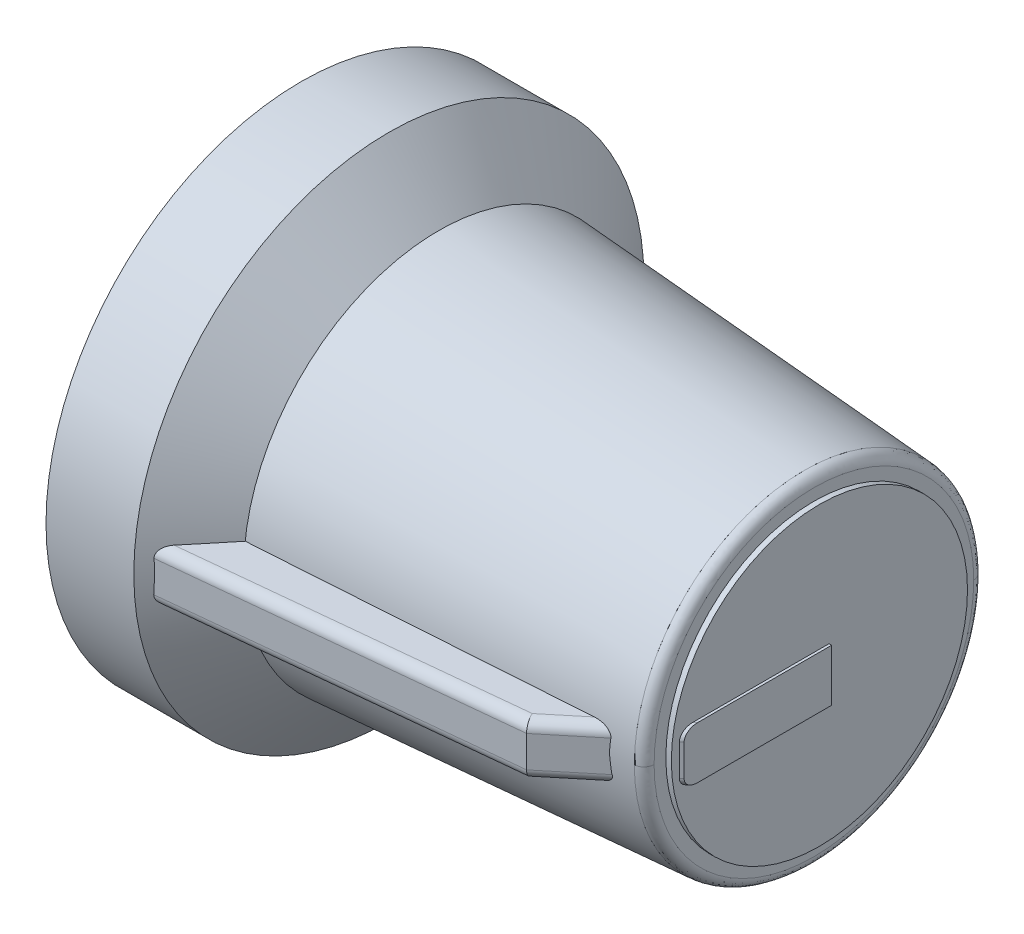
ISO-10303-21;
HEADER;
FILE_DESCRIPTION(('STEP AP214'),'2;1');
FILE_NAME('part.step','',(''),(''),'','','');
FILE_SCHEMA(('AUTOMOTIVE_DESIGN { 1 0 10303 214 1 1 1 1 }'));
ENDSEC;
DATA;
#1=APPLICATION_CONTEXT('core data for automotive mechanical design processes');
#2=APPLICATION_PROTOCOL_DEFINITION('international standard','automotive_design',2000,#1);
#3=PRODUCT_CONTEXT('',#1,'mechanical');
#4=PRODUCT('Part','Part','',(#3));
#5=PRODUCT_RELATED_PRODUCT_CATEGORY('part','',(#4));
#6=PRODUCT_DEFINITION_FORMATION('','',#4);
#7=PRODUCT_DEFINITION_CONTEXT('part definition',#1,'design');
#8=PRODUCT_DEFINITION('design','',#6,#7);
#9=PRODUCT_DEFINITION_SHAPE('','',#8);
#10=(LENGTH_UNIT() NAMED_UNIT(*) SI_UNIT(.MILLI.,.METRE.));
#11=(NAMED_UNIT(*) PLANE_ANGLE_UNIT() SI_UNIT($,.RADIAN.));
#12=(NAMED_UNIT(*) SI_UNIT($,.STERADIAN.) SOLID_ANGLE_UNIT());
#13=UNCERTAINTY_MEASURE_WITH_UNIT(LENGTH_MEASURE(1.E-05),#10,'distance_accuracy_value','');
#14=(GEOMETRIC_REPRESENTATION_CONTEXT(3) GLOBAL_UNCERTAINTY_ASSIGNED_CONTEXT((#13)) GLOBAL_UNIT_ASSIGNED_CONTEXT((#10,
#11,#12)) REPRESENTATION_CONTEXT('',''));
#15=CARTESIAN_POINT('',(0.,0.,0.));
#16=DIRECTION('',(0.,0.,1.));
#17=DIRECTION('',(1.,0.,0.));
#18=AXIS2_PLACEMENT_3D('',#15,#16,#17);
#19=CARTESIAN_POINT('',(-3.53295966109857,-0.560571610373937,7.49515223701913));
#20=DIRECTION('',(0.99477660749897,0.,-0.102075957859035));
#21=DIRECTION('',(-0.102075957859035,0.,-0.99477660749897));
#22=AXIS2_PLACEMENT_3D('',#19,#20,#21);
#23=CYLINDRICAL_SURFACE('',#22,0.300000000000001);
#24=CARTESIAN_POINT('',(2.52600936770284,-0.560571610373928,6.87342966876526));
#25=DIRECTION('',(-1.,0.,0.));
#26=DIRECTION('',(0.,0.,-1.));
#27=AXIS2_PLACEMENT_3D('',#24,#25,#26);
#28=ELLIPSE('',#27,0.301575245877815,0.300000000000001);
#29=CARTESIAN_POINT('',(2.52600936770284,-0.560571610373932,7.17500491464307));
#30=VERTEX_POINT('',#29);
#31=CARTESIAN_POINT('',(2.52600936770284,-0.860571610373941,6.87342966876526));
#32=VERTEX_POINT('',#31);
#33=EDGE_CURVE('P0_E20',#30,#32,#28,.F.);
#34=ORIENTED_EDGE('',*,*,#33,.T.);
#35=DIRECTION('',(-0.99477660749897,0.,0.102075957859035));
#36=VECTOR('',#35,1.);
#37=CARTESIAN_POINT('',(12.558461253041,-0.860571610373953,5.8439803148593));
#38=LINE('',#37,#36);
#39=CARTESIAN_POINT('',(12.5584612530412,-0.860571610373953,5.84398031485928));
#40=VERTEX_POINT('',#39);
#41=EDGE_CURVE('P0_E191',#40,#32,#38,.T.);
#42=ORIENTED_EDGE('',*,*,#41,.F.);
#43=CARTESIAN_POINT('',(12.5584612530415,-0.560571610373989,5.84398031485926));
#44=DIRECTION('',(0.922679702901846,0.,-0.385567329856875));
#45=DIRECTION('',(-0.385567329856875,0.,-0.922679702901846));
#46=AXIS2_PLACEMENT_3D('',#43,#44,#45);
#47=ELLIPSE('',#46,0.313408447300497,0.299999999999996);
#48=CARTESIAN_POINT('',(12.6793013112214,-0.560571610373941,6.13315592790131));
#49=VERTEX_POINT('',#48);
#50=EDGE_CURVE('P0_E208',#49,#40,#47,.T.);
#51=ORIENTED_EDGE('',*,*,#50,.F.);
#52=DIRECTION('',(0.99477660749897,0.,-0.102075957859035));
#53=VECTOR('',#52,1.);
#54=CARTESIAN_POINT('',(2.52600936770284,-0.560571610373936,7.17500491464307));
#55=LINE('',#54,#53);
#56=EDGE_CURVE('P0_E187',#30,#49,#55,.T.);
#57=ORIENTED_EDGE('',*,*,#56,.F.);
#58=EDGE_LOOP('',(#34,#42,#51,#57));
#59=FACE_BOUND('',#58,.T.);
#60=ADVANCED_FACE('P0_F16',(#59),#23,.T.);
#61=CARTESIAN_POINT('',(8.2765478021315,-0.560571610373942,9.37361754749908));
#62=DIRECTION('',(0.771633412746272,0.,-0.636067509257894));
#63=DIRECTION('',(-0.636067509257894,0.,-0.771633412746272));
#64=AXIS2_PLACEMENT_3D('',#61,#62,#63);
#65=CYLINDRICAL_SURFACE('',#64,0.299999999999992);
#66=CARTESIAN_POINT('',(15.2071005699621,-0.56057161037414,3.66067230174421));
#67=DIRECTION('',(1.,0.,0.));
#68=DIRECTION('',(0.,0.,-1.));
#69=AXIS2_PLACEMENT_3D('',#66,#67,#68);
#70=ELLIPSE('',#69,0.388785652674475,0.299999999999992);
#71=CARTESIAN_POINT('',(15.2071005699621,-0.86057161037404,3.66067230174393));
#72=VERTEX_POINT('',#71);
#73=CARTESIAN_POINT('',(15.2071005699621,-0.560571610374038,4.04945795441841));
#74=VERTEX_POINT('',#73);
#75=EDGE_CURVE('P0_E193',#72,#74,#70,.F.);
#76=ORIENTED_EDGE('',*,*,#75,.T.);
#77=DIRECTION('',(0.771633412746241,0.,-0.636067509257932));
#78=VECTOR('',#77,1.);
#79=CARTESIAN_POINT('',(12.6793013112213,-0.560571610373942,6.13315592790139));
#80=LINE('',#79,#78);
#81=EDGE_CURVE('P0_E183',#49,#74,#80,.T.);
#82=ORIENTED_EDGE('',*,*,#81,.F.);
#83=ORIENTED_EDGE('',*,*,#50,.T.);
#84=DIRECTION('',(-0.77163341274624,0.,0.636067509257934));
#85=VECTOR('',#84,1.);
#86=CARTESIAN_POINT('',(15.2071005699621,-0.860571610373953,3.66067230174365));
#87=LINE('',#86,#85);
#88=EDGE_CURVE('P0_E190',#72,#40,#87,.T.);
#89=ORIENTED_EDGE('',*,*,#88,.F.);
#90=EDGE_LOOP('',(#76,#82,#83,#89));
#91=FACE_BOUND('',#90,.T.);
#92=ADVANCED_FACE('P0_F213',(#91),#65,.T.);
#93=CARTESIAN_POINT('',(2.39919845568026,-0.860571610373953,-0.34392450912705));
#94=DIRECTION('',(0.,-1.,0.));
#95=DIRECTION('',(0.,0.,-1.));
#96=AXIS2_PLACEMENT_3D('',#93,#94,#95);
#97=PLANE('',#96);
#98=DIRECTION('',(0.,0.,-1.));
#99=VECTOR('',#98,1.);
#100=CARTESIAN_POINT('',(15.2071005699621,-0.860571610373944,4.04945795441813));
#101=LINE('',#100,#99);
#102=CARTESIAN_POINT('',(15.2071005699621,-0.86057161037395,-0.268427290633258));
#103=VERTEX_POINT('',#102);
#104=EDGE_CURVE('P0_E176',#72,#103,#101,.T.);
#105=ORIENTED_EDGE('',*,*,#104,.F.);
#106=ORIENTED_EDGE('',*,*,#88,.T.);
#107=ORIENTED_EDGE('',*,*,#41,.T.);
#108=DIRECTION('',(0.,0.,1.));
#109=VECTOR('',#108,1.);
#110=CARTESIAN_POINT('',(2.52600936770284,-0.860571610373942,-0.26947966334715));
#111=LINE('',#110,#109);
#112=CARTESIAN_POINT('',(2.52600936770284,-0.860571610373943,3.84211769787774));
#113=VERTEX_POINT('',#112);
#114=EDGE_CURVE('P0_E144',#113,#32,#111,.T.);
#115=ORIENTED_EDGE('',*,*,#114,.F.);
#116=DIRECTION('',(-1.,0.,0.));
#117=VECTOR('',#116,1.);
#118=CARTESIAN_POINT('',(2.52600936770284,-0.860571610373945,3.84211769787774));
#119=LINE('',#118,#117);
#120=CARTESIAN_POINT('',(11.0593130452335,-0.860571610373948,3.84211769787774));
#121=VERTEX_POINT('',#120);
#122=EDGE_CURVE('P0_E79',#121,#113,#119,.T.);
#123=ORIENTED_EDGE('',*,*,#122,.F.);
#124=DIRECTION('',(0.,0.,1.));
#125=VECTOR('',#124,1.);
#126=CARTESIAN_POINT('',(11.0593130452335,-0.860571610373953,3.84211769787774));
#127=LINE('',#126,#125);
#128=CARTESIAN_POINT('',(11.0593130452335,-0.860571610373953,-0.268771505365607));
#129=VERTEX_POINT('',#128);
#130=EDGE_CURVE('P0_E159',#129,#121,#127,.T.);
#131=ORIENTED_EDGE('',*,*,#130,.F.);
#132=DIRECTION('',(-0.999999996556533,0.,-8.29875515821077E-05));
#133=VECTOR('',#132,1.);
#134=CARTESIAN_POINT('',(15.2071005699621,-0.860571610373953,-0.268427290633257));
#135=LINE('',#134,#133);
#136=EDGE_CURVE('P0_E169',#103,#129,#135,.T.);
#137=ORIENTED_EDGE('',*,*,#136,.F.);
#138=EDGE_LOOP('',(#105,#106,#107,#115,#123,#131,#137));
#139=FACE_BOUND('',#138,.T.);
#140=ADVANCED_FACE('P0_F216',(#139),#97,.T.);
#141=CARTESIAN_POINT('',(2.52600936770284,0.662139851356403,7.17500491464307));
#142=DIRECTION('',(0.102075957859035,0.,0.99477660749897));
#143=DIRECTION('',(0.99477660749897,0.,-0.102075957859035));
#144=AXIS2_PLACEMENT_3D('',#141,#142,#143);
#145=PLANE('',#144);
#146=ORIENTED_EDGE('',*,*,#56,.T.);
#147=DIRECTION('',(0.,1.,0.));
#148=VECTOR('',#147,1.);
#149=CARTESIAN_POINT('',(12.6793013112213,0.663662565166132,6.1331559279014));
#150=LINE('',#149,#148);
#151=CARTESIAN_POINT('',(12.6793013112217,0.362139851356411,6.13315592790106));
#152=VERTEX_POINT('',#151);
#153=EDGE_CURVE('P0_E184',#152,#49,#150,.F.);
#154=ORIENTED_EDGE('',*,*,#153,.F.);
#155=DIRECTION('',(0.99477660749897,0.,-0.102075957859036));
#156=VECTOR('',#155,1.);
#157=CARTESIAN_POINT('',(7.57281204123712,0.362139851356413,6.65714270000803));
#158=LINE('',#157,#156);
#159=CARTESIAN_POINT('',(2.52600936770284,0.362139851356412,7.17500491464281));
#160=VERTEX_POINT('',#159);
#161=EDGE_CURVE('P0_E137',#160,#152,#158,.T.);
#162=ORIENTED_EDGE('',*,*,#161,.F.);
#163=DIRECTION('',(0.,1.,0.));
#164=VECTOR('',#163,1.);
#165=CARTESIAN_POINT('',(2.52600936770284,0.662139851356417,7.17500491464305));
#166=LINE('',#165,#164);
#167=EDGE_CURVE('P0_E142',#30,#160,#166,.T.);
#168=ORIENTED_EDGE('',*,*,#167,.F.);
#169=EDGE_LOOP('',(#146,#154,#162,#168));
#170=FACE_BOUND('',#169,.T.);
#171=ADVANCED_FACE('P0_F222',(#170),#145,.T.);
#172=CARTESIAN_POINT('',(12.6793013112213,0.663662565166132,6.13315592790139));
#173=DIRECTION('',(0.636067509257932,0.,0.771633412746241));
#174=DIRECTION('',(0.771633412746241,0.,-0.636067509257932));
#175=AXIS2_PLACEMENT_3D('',#172,#173,#174);
#176=PLANE('',#175);
#177=ORIENTED_EDGE('',*,*,#81,.T.);
#178=DIRECTION('',(0.,1.,0.));
#179=VECTOR('',#178,1.);
#180=CARTESIAN_POINT('',(15.2071005699621,0.663662563633479,4.04945795441815));
#181=LINE('',#180,#179);
#182=CARTESIAN_POINT('',(15.2071005699621,0.362139851356398,4.04945795441833));
#183=VERTEX_POINT('',#182);
#184=EDGE_CURVE('P0_E103',#183,#74,#181,.F.);
#185=ORIENTED_EDGE('',*,*,#184,.F.);
#186=DIRECTION('',(0.771633412746241,0.,-0.636067509257932));
#187=VECTOR('',#186,1.);
#188=CARTESIAN_POINT('',(14.1752835530566,0.362139851356409,4.89999820981901));
#189=LINE('',#188,#187);
#190=EDGE_CURVE('P0_E122',#152,#183,#189,.T.);
#191=ORIENTED_EDGE('',*,*,#190,.F.);
#192=ORIENTED_EDGE('',*,*,#153,.T.);
#193=EDGE_LOOP('',(#177,#185,#191,#192));
#194=FACE_BOUND('',#193,.T.);
#195=ADVANCED_FACE('P0_F219',(#194),#176,.T.);
#196=CARTESIAN_POINT('',(15.2071005699621,0.663662563633479,4.04945795441813));
#197=DIRECTION('',(1.,0.,0.));
#198=DIRECTION('',(0.,0.,-1.));
#199=AXIS2_PLACEMENT_3D('',#196,#197,#198);
#200=PLANE('',#199);
#201=DIRECTION('',(0.,1.,0.));
#202=VECTOR('',#201,1.);
#203=CARTESIAN_POINT('',(15.2071005699621,0.662139851356417,-0.268427290633261));
#204=LINE('',#203,#202);
#205=CARTESIAN_POINT('',(15.2071005699621,0.662139851356399,-0.268427290633262));
#206=VERTEX_POINT('',#205);
#207=EDGE_CURVE('P0_E114',#206,#103,#204,.F.);
#208=ORIENTED_EDGE('',*,*,#207,.F.);
#209=DIRECTION('',(0.,0.,1.));
#210=VECTOR('',#209,1.);
#211=CARTESIAN_POINT('',(15.2071005699621,0.662139851356399,-0.343924509127053));
#212=LINE('',#211,#210);
#213=CARTESIAN_POINT('',(15.2071005699621,0.662139851356397,3.66067230174382));
#214=VERTEX_POINT('',#213);
#215=EDGE_CURVE('P0_E108',#214,#206,#212,.F.);
#216=ORIENTED_EDGE('',*,*,#215,.F.);
#217=CARTESIAN_POINT('',(15.2071005699621,0.362139851356389,3.66067230174401));
#218=DIRECTION('',(1.,0.,0.));
#219=DIRECTION('',(0.,0.,1.));
#220=AXIS2_PLACEMENT_3D('',#217,#218,#219);
#221=ELLIPSE('',#220,0.388785652674526,0.300000000000006);
#222=EDGE_CURVE('P0_E111',#183,#214,#221,.F.);
#223=ORIENTED_EDGE('',*,*,#222,.F.);
#224=ORIENTED_EDGE('',*,*,#184,.T.);
#225=ORIENTED_EDGE('',*,*,#75,.F.);
#226=ORIENTED_EDGE('',*,*,#104,.T.);
#227=EDGE_LOOP('',(#208,#216,#223,#224,#225,#226));
#228=FACE_BOUND('',#227,.T.);
#229=ADVANCED_FACE('P0_F110',(#228),#200,.T.);
#230=CARTESIAN_POINT('',(15.2071005699621,0.662139851356417,-0.268427290633261));
#231=DIRECTION('',(8.29875515821077E-05,0.,-0.999999996556533));
#232=DIRECTION('',(-0.999999996556533,0.,-8.29875515821077E-05));
#233=AXIS2_PLACEMENT_3D('',#230,#231,#232);
#234=PLANE('',#233);
#235=ORIENTED_EDGE('',*,*,#136,.T.);
#236=DIRECTION('',(0.,1.,0.));
#237=VECTOR('',#236,1.);
#238=CARTESIAN_POINT('',(11.0593130452335,-0.860571610373953,-0.268771505365608));
#239=LINE('',#238,#237);
#240=CARTESIAN_POINT('',(11.0593130452335,0.662139851356399,-0.268771505365608));
#241=VERTEX_POINT('',#240);
#242=EDGE_CURVE('P0_E166',#241,#129,#239,.F.);
#243=ORIENTED_EDGE('',*,*,#242,.F.);
#244=DIRECTION('',(-0.999999996556533,0.,-8.29875515822811E-05));
#245=VECTOR('',#244,1.);
#246=CARTESIAN_POINT('',(15.2071005699621,0.662139851356399,-0.268427290633262));
#247=LINE('',#246,#245);
#248=EDGE_CURVE('P0_E118',#206,#241,#247,.T.);
#249=ORIENTED_EDGE('',*,*,#248,.F.);
#250=ORIENTED_EDGE('',*,*,#207,.T.);
#251=EDGE_LOOP('',(#235,#243,#249,#250));
#252=FACE_BOUND('',#251,.T.);
#253=ADVANCED_FACE('P0_F232',(#252),#234,.T.);
#254=CARTESIAN_POINT('',(11.0593130452335,-0.860571610373953,3.84211769787774));
#255=DIRECTION('',(-1.,0.,0.));
#256=DIRECTION('',(0.,0.,1.));
#257=AXIS2_PLACEMENT_3D('',#254,#255,#256);
#258=PLANE('',#257);
#259=DIRECTION('',(0.,1.,0.));
#260=VECTOR('',#259,1.);
#261=CARTESIAN_POINT('',(11.0593130452335,-0.860571610373944,3.84211769787774));
#262=LINE('',#261,#260);
#263=CARTESIAN_POINT('',(11.0593130452335,0.662139851356399,3.84211769787774));
#264=VERTEX_POINT('',#263);
#265=EDGE_CURVE('P0_E157',#264,#121,#262,.F.);
#266=ORIENTED_EDGE('',*,*,#265,.F.);
#267=DIRECTION('',(0.,0.,1.));
#268=VECTOR('',#267,1.);
#269=CARTESIAN_POINT('',(11.0593130452335,0.662139851356399,-0.343924509127053));
#270=LINE('',#269,#268);
#271=EDGE_CURVE('P0_E154',#241,#264,#270,.T.);
#272=ORIENTED_EDGE('',*,*,#271,.F.);
#273=ORIENTED_EDGE('',*,*,#242,.T.);
#274=ORIENTED_EDGE('',*,*,#130,.T.);
#275=EDGE_LOOP('',(#266,#272,#273,#274));
#276=FACE_BOUND('',#275,.T.);
#277=ADVANCED_FACE('P0_F230',(#276),#258,.T.);
#278=CARTESIAN_POINT('',(2.52600936770284,-0.860571610373944,3.84211769787774));
#279=DIRECTION('',(0.,0.,-1.));
#280=DIRECTION('',(-1.,0.,0.));
#281=AXIS2_PLACEMENT_3D('',#278,#279,#280);
#282=PLANE('',#281);
#283=ORIENTED_EDGE('',*,*,#122,.T.);
#284=DIRECTION('',(0.,1.,0.));
#285=VECTOR('',#284,1.);
#286=CARTESIAN_POINT('',(2.52600936770284,0.662139851356417,3.84211769787774));
#287=LINE('',#286,#285);
#288=CARTESIAN_POINT('',(2.52600936770284,0.662139851356399,3.84211769787774));
#289=VERTEX_POINT('',#288);
#290=EDGE_CURVE('P0_E146',#289,#113,#287,.F.);
#291=ORIENTED_EDGE('',*,*,#290,.F.);
#292=DIRECTION('',(1.,0.,0.));
#293=VECTOR('',#292,1.);
#294=CARTESIAN_POINT('',(2.39919845568026,0.662139851356399,3.84211769787774));
#295=LINE('',#294,#293);
#296=EDGE_CURVE('P0_E131',#264,#289,#295,.F.);
#297=ORIENTED_EDGE('',*,*,#296,.F.);
#298=ORIENTED_EDGE('',*,*,#265,.T.);
#299=EDGE_LOOP('',(#283,#291,#297,#298));
#300=FACE_BOUND('',#299,.T.);
#301=ADVANCED_FACE('P0_F228',(#300),#282,.T.);
#302=CARTESIAN_POINT('',(2.52600936770284,0.662139851356417,-0.26947966334715));
#303=DIRECTION('',(-1.,0.,0.));
#304=DIRECTION('',(0.,0.,1.));
#305=AXIS2_PLACEMENT_3D('',#302,#303,#304);
#306=PLANE('',#305);
#307=ORIENTED_EDGE('',*,*,#33,.F.);
#308=ORIENTED_EDGE('',*,*,#167,.T.);
#309=CARTESIAN_POINT('',(2.52600936770284,0.36213985135641,6.87342966876473));
#310=DIRECTION('',(-1.,0.,0.));
#311=DIRECTION('',(0.,0.,1.));
#312=AXIS2_PLACEMENT_3D('',#309,#310,#311);
#313=ELLIPSE('',#312,0.301575245877813,0.299999999999999);
#314=CARTESIAN_POINT('',(2.52600936770284,0.662139851356404,6.87342966876499));
#315=VERTEX_POINT('',#314);
#316=EDGE_CURVE('P0_E138',#315,#160,#313,.F.);
#317=ORIENTED_EDGE('',*,*,#316,.F.);
#318=DIRECTION('',(0.,0.,1.));
#319=VECTOR('',#318,1.);
#320=CARTESIAN_POINT('',(2.52600936770284,0.662139851356399,-0.343924509127053));
#321=LINE('',#320,#319);
#322=EDGE_CURVE('P0_E128',#289,#315,#321,.T.);
#323=ORIENTED_EDGE('',*,*,#322,.F.);
#324=ORIENTED_EDGE('',*,*,#290,.T.);
#325=ORIENTED_EDGE('',*,*,#114,.T.);
#326=EDGE_LOOP('',(#307,#308,#317,#323,#324,#325));
#327=FACE_BOUND('',#326,.T.);
#328=ADVANCED_FACE('P0_F225',(#327),#306,.T.);
#329=CARTESIAN_POINT('',(18.6173381688574,0.36213985135641,5.22226719849754));
#330=DIRECTION('',(-0.994776607498974,0.,0.102075957859003));
#331=DIRECTION('',(0.102075957859003,0.,0.994776607498974));
#332=AXIS2_PLACEMENT_3D('',#329,#330,#331);
#333=CYLINDRICAL_SURFACE('',#332,0.299999999999999);
#334=ORIENTED_EDGE('',*,*,#161,.T.);
#335=CARTESIAN_POINT('',(12.5584612530421,0.362139851356396,5.84398031485898));
#336=DIRECTION('',(-0.922679702901833,0.,0.385567329856908));
#337=DIRECTION('',(0.385567329856908,0.,0.922679702901833));
#338=AXIS2_PLACEMENT_3D('',#335,#336,#337);
#339=ELLIPSE('',#338,0.31340844730051,0.300000000000003);
#340=CARTESIAN_POINT('',(12.5584612530416,0.662139851356399,5.84398031485924));
#341=VERTEX_POINT('',#340);
#342=EDGE_CURVE('P0_E35',#341,#152,#339,.F.);
#343=ORIENTED_EDGE('',*,*,#342,.F.);
#344=DIRECTION('',(0.99477660749897,0.,-0.102075957859035));
#345=VECTOR('',#344,1.);
#346=CARTESIAN_POINT('',(2.52600936770284,0.662139851356399,6.87342966876526));
#347=LINE('',#346,#345);
#348=EDGE_CURVE('P0_E26',#315,#341,#347,.T.);
#349=ORIENTED_EDGE('',*,*,#348,.F.);
#350=ORIENTED_EDGE('',*,*,#316,.T.);
#351=EDGE_LOOP('',(#334,#343,#349,#350));
#352=FACE_BOUND('',#351,.T.);
#353=ADVANCED_FACE('P0_F224',(#352),#333,.T.);
#354=CARTESIAN_POINT('',(19.6923787984269,0.362139851356401,-0.0366011755087956));
#355=DIRECTION('',(-0.771633412746207,0.,0.636067509257973));
#356=DIRECTION('',(0.636067509257973,0.,0.771633412746207));
#357=AXIS2_PLACEMENT_3D('',#354,#355,#356);
#358=CYLINDRICAL_SURFACE('',#357,0.300000000000006);
#359=ORIENTED_EDGE('',*,*,#190,.T.);
#360=ORIENTED_EDGE('',*,*,#222,.T.);
#361=DIRECTION('',(0.771633412746238,0.,-0.636067509257935));
#362=VECTOR('',#361,1.);
#363=CARTESIAN_POINT('',(12.558461253041,0.662139851356399,5.8439803148593));
#364=LINE('',#363,#362);
#365=EDGE_CURVE('P0_E10',#341,#214,#364,.T.);
#366=ORIENTED_EDGE('',*,*,#365,.F.);
#367=ORIENTED_EDGE('',*,*,#342,.T.);
#368=EDGE_LOOP('',(#359,#360,#366,#367));
#369=FACE_BOUND('',#368,.T.);
#370=ADVANCED_FACE('P0_F18',(#369),#358,.T.);
#371=CARTESIAN_POINT('',(2.39919845568026,0.662139851356399,-0.343924509127053));
#372=DIRECTION('',(0.,1.,0.));
#373=DIRECTION('',(0.,0.,1.));
#374=AXIS2_PLACEMENT_3D('',#371,#372,#373);
#375=PLANE('',#374);
#376=ORIENTED_EDGE('',*,*,#348,.T.);
#377=ORIENTED_EDGE('',*,*,#365,.T.);
#378=ORIENTED_EDGE('',*,*,#215,.T.);
#379=ORIENTED_EDGE('',*,*,#248,.T.);
#380=ORIENTED_EDGE('',*,*,#271,.T.);
#381=ORIENTED_EDGE('',*,*,#296,.T.);
#382=ORIENTED_EDGE('',*,*,#322,.T.);
#383=EDGE_LOOP('',(#376,#377,#378,#379,#380,#381,#382));
#384=FACE_BOUND('',#383,.T.);
#385=ADVANCED_FACE('P0_F124',(#384),#375,.T.);
#386=CLOSED_SHELL('',(#60,#92,#140,#171,#195,#229,#253,#277,#301,#328,#353,#370,#385));
#387=MANIFOLD_SOLID_BREP('P0_B1',#386);
#388=CARTESIAN_POINT('',(14.9705004260795,-4.42057777271192,-4.40614193301534));
#389=DIRECTION('',(-1.,0.,0.));
#390=DIRECTION('',(0.,0.,1.));
#391=AXIS2_PLACEMENT_3D('',#388,#389,#390);
#392=PLANE('',#391);
#393=CARTESIAN_POINT('',(14.9705004260795,0.,0.0144358396965782));
#394=DIRECTION('',(1.,0.,0.));
#395=DIRECTION('',(0.,0.,-1.));
#396=AXIS2_PLACEMENT_3D('',#393,#394,#395);
#397=CIRCLE('',#396,4.33389977716855);
#398=CARTESIAN_POINT('',(14.9705004260795,0.,-4.31946393747197));
#399=VERTEX_POINT('',#398);
#400=EDGE_CURVE('P1_E19',#399,#399,#397,.T.);
#401=ORIENTED_EDGE('',*,*,#400,.F.);
#402=EDGE_LOOP('',(#401));
#403=FACE_BOUND('',#402,.T.);
#404=ADVANCED_FACE('P1_F15',(#403),#392,.T.);
#405=CARTESIAN_POINT('',(14.9705004260795,0.,0.0144358396965782));
#406=DIRECTION('',(1.,0.,0.));
#407=DIRECTION('',(0.,0.,-1.));
#408=AXIS2_PLACEMENT_3D('',#405,#406,#407);
#409=CYLINDRICAL_SURFACE('',#408,4.33389977716855);
#410=CARTESIAN_POINT('',(15.1314707801346,0.,0.0144358396965782));
#411=DIRECTION('',(1.,0.,0.));
#412=DIRECTION('',(0.,0.,-1.));
#413=AXIS2_PLACEMENT_3D('',#410,#411,#412);
#414=CIRCLE('',#413,4.33389977716855);
#415=CARTESIAN_POINT('',(15.1314707801346,0.,-4.31946393747197));
#416=VERTEX_POINT('',#415);
#417=EDGE_CURVE('P1_E10',#416,#416,#414,.T.);
#418=ORIENTED_EDGE('',*,*,#417,.F.);
#419=EDGE_LOOP('',(#418));
#420=FACE_BOUND('',#419,.T.);
#421=ORIENTED_EDGE('',*,*,#400,.T.);
#422=EDGE_LOOP('',(#421));
#423=FACE_BOUND('',#422,.T.);
#424=ADVANCED_FACE('P1_F17',(#420,#423),#409,.T.);
#425=CARTESIAN_POINT('',(15.1314707801346,-4.42057777271192,-4.40614193301534));
#426=DIRECTION('',(1.,0.,0.));
#427=DIRECTION('',(0.,0.,-1.));
#428=AXIS2_PLACEMENT_3D('',#425,#426,#427);
#429=PLANE('',#428);
#430=ORIENTED_EDGE('',*,*,#417,.T.);
#431=EDGE_LOOP('',(#430));
#432=FACE_BOUND('',#431,.T.);
#433=ADVANCED_FACE('P1_F34',(#432),#429,.T.);
#434=CLOSED_SHELL('',(#404,#424,#433));
#435=MANIFOLD_SOLID_BREP('P1_B1',#434);
#436=CARTESIAN_POINT('',(14.6909075925207,0.,-4.96253625272589));
#437=CARTESIAN_POINT('',(14.9705004260795,0.,-4.94347310498324));
#438=CARTESIAN_POINT('',(14.9705004260795,0.,-4.66323114492142));
#439=CARTESIAN_POINT('',(14.9705004260795,0.,-4.66118324538693));
#440=CARTESIAN_POINT('',(14.9705004260795,0.,-4.65913534585243));
#441=CARTESIAN_POINT('',(14.6909075925207,0.625316140749484,-4.96276394514999));
#442=CARTESIAN_POINT('',(14.9705004260795,0.622921010988742,-4.94369992528385));
#443=CARTESIAN_POINT('',(14.9705004260795,0.587710883688898,-4.66344514438036));
#444=CARTESIAN_POINT('',(14.9705004260795,0.587453581737074,-4.66139715115613));
#445=CARTESIAN_POINT('',(14.9705004260795,0.58719627978525,-4.6593491579319));
#446=CARTESIAN_POINT('',(14.6909075925207,1.9282242731094,-4.71426853788099));
#447=CARTESIAN_POINT('',(14.9705004260795,1.920838653195,-4.6961563225607));
#448=CARTESIAN_POINT('',(14.9705004260795,1.81226473722756,-4.42989375192205));
#449=CARTESIAN_POINT('',(14.9705004260795,1.81147132116696,-4.42794800834267));
#450=CARTESIAN_POINT('',(14.9705004260795,1.81067790510635,-4.42600226476328));
#451=CARTESIAN_POINT('',(14.6909075925207,3.61869061898029,-3.60429897982679));
#452=CARTESIAN_POINT('',(14.9705004260795,3.60483005624788,-3.59043824779434));
#453=CARTESIAN_POINT('',(14.9705004260795,3.40106983153929,-3.38667553425388));
#454=CARTESIAN_POINT('',(14.9705004260795,3.39958083085846,-3.38518651538563));
#455=CARTESIAN_POINT('',(14.9705004260795,3.39809183017763,-3.38369749651739));
#456=CARTESIAN_POINT('',(14.6909075925207,4.72878189539451,-1.91375415181792));
#457=CARTESIAN_POINT('',(14.9705004260795,4.71066938316003,-1.90636866321131));
#458=CARTESIAN_POINT('',(14.9705004260795,4.44440244766972,-1.79779667756236));
#459=CARTESIAN_POINT('',(14.9705004260795,4.44245667219369,-1.79700327560778));
#460=CARTESIAN_POINT('',(14.9705004260795,4.44051089671767,-1.79620987365319));
#461=CARTESIAN_POINT('',(14.6909075925207,5.09625816408454,0.0144204175099702));
#462=CARTESIAN_POINT('',(14.9705004260795,5.0767381184599,0.0144204765811108));
#463=CARTESIAN_POINT('',(14.9705004260795,4.78977943145852,0.0144213449692996));
#464=CARTESIAN_POINT('',(14.9705004260795,4.78768244868906,0.0144213513151436));
#465=CARTESIAN_POINT('',(14.9705004260795,4.7855854659196,0.0144213576609877));
#466=CARTESIAN_POINT('',(14.6909075925207,4.72878003297792,1.94266465984736));
#467=CARTESIAN_POINT('',(14.9705004260795,4.710667527877,1.93527902251657));
#468=CARTESIAN_POINT('',(14.9705004260795,4.44440069725512,1.82670485051558));
#469=CARTESIAN_POINT('',(14.9705004260795,4.44245492254543,1.82591143258398));
#470=CARTESIAN_POINT('',(14.9705004260795,4.44050914783574,1.82511801465239));
#471=CARTESIAN_POINT('',(14.6909075925207,3.61869535970654,3.6331061308542));
#472=CARTESIAN_POINT('',(14.9705004260795,3.60483477881586,3.61924564598284));
#473=CARTESIAN_POINT('',(14.9705004260795,3.40107428716779,3.41548656588764));
#474=CARTESIAN_POINT('',(14.9705004260795,3.39958528453627,3.4139975735712));
#475=CARTESIAN_POINT('',(14.9705004260795,3.39809628190475,3.41250858125476));
#476=CARTESIAN_POINT('',(14.6909075925207,1.92821408590769,4.74326193762332));
#477=CARTESIAN_POINT('',(14.9705004260795,1.92082850501303,4.72514925608121));
#478=CARTESIAN_POINT('',(14.9705004260795,1.8122551626637,4.45887983164701));
#479=CARTESIAN_POINT('',(14.9705004260795,1.81146175079488,4.45693403798275));
#480=CARTESIAN_POINT('',(14.9705004260795,1.81066833892605,4.45498824431849));
#481=CARTESIAN_POINT('',(14.6909075925207,0.625326822907937,4.99151357406124));
#482=CARTESIAN_POINT('',(14.9705004260795,0.622931652231636,4.97245002168142));
#483=CARTESIAN_POINT('',(14.9705004260795,0.587720923443791,4.6922021131625));
#484=CARTESIAN_POINT('',(14.9705004260795,0.587463617096526,4.69015417015899));
#485=CARTESIAN_POINT('',(14.9705004260795,0.587206310749261,4.68810622715548));
#486=CARTESIAN_POINT('',(14.6909075925207,-1.83647319833974E-06,4.99150977721786));
#487=CARTESIAN_POINT('',(14.9705004260795,-1.82943900669564E-06,4.97244623938098));
#488=CARTESIAN_POINT('',(14.9705004260795,-1.7260313901887E-06,4.69219854465366));
#489=CARTESIAN_POINT('',(14.9705004260795,-1.72527572745796E-06,4.69015060321246));
#490=CARTESIAN_POINT('',(14.9705004260795,-1.72452006472722E-06,4.68810266177125));
#491=(BOUNDED_SURFACE() B_SPLINE_SURFACE(3,2,((#436,#437,#438,#439,#440),(#441,#442,#443,#444,
#445),(#446,#447,#448,#449,#450),(#451,#452,#453,#454,#455),(#456,#457,#458,#459,#460),(#461,
#462,#463,#464,#465),(#466,#467,#468,#469,#470),(#471,#472,#473,#474,#475),(#476,#477,#478,#479,
#480),(#481,#482,#483,#484,#485),(#486,#487,#488,#489,#490)),.UNSPECIFIED.,.F.,.F.,
.F.) B_SPLINE_SURFACE_WITH_KNOTS((4,1,1,1,1,1,1,1,4),(3,2,3),(0.,1.76324785067493,
3.67373824076323,5.58422863085152,7.34747648152646,9.11072433220139,11.0212147222897,
12.931705112378,14.6949529630529),(0.,0.450815960561119,0.45532412016673),
.UNSPECIFIED.) GEOMETRIC_REPRESENTATION_ITEM() RATIONAL_B_SPLINE_SURFACE(((1.,0.730761208650739,
1.,1.,1.),(0.999999999999999,0.730761208650733,0.999999999999999,0.999999999999999,
0.999999999999999),(0.999999999999999,0.730761208650724,0.999999999999999,0.999999999999999,
0.999999999999999),(0.999999999999999,0.730761208650717,0.999999999999999,0.999999999999999,
0.999999999999999),(1.,0.730761208650724,1.,1.,1.),(0.999999999999999,0.730761208650741,
0.999999999999999,0.999999999999999,0.999999999999999),(0.999999999999999,0.730761208650724,
0.999999999999999,0.999999999999999,0.999999999999999),(0.999999999999999,0.730761208650715,
0.999999999999999,0.999999999999999,0.999999999999999),(1.,0.730761208650725,1.,1.,1.),
(0.999999999999999,0.730761208650736,0.999999999999999,0.999999999999999,0.999999999999999),
(0.999999999999999,0.730761208650736,0.999999999999999,0.999999999999999,0.999999999999999))) REPRESENTATION_ITEM('') SURFACE());
#492=CARTESIAN_POINT('',(14.6909075925207,0.,-4.96253625272589));
#493=CARTESIAN_POINT('',(14.9705004260795,0.,-4.94347310498324));
#494=CARTESIAN_POINT('',(14.9705004260795,0.,-4.66323114492142));
#495=CARTESIAN_POINT('',(14.9705004260795,0.,-4.66118324538693));
#496=CARTESIAN_POINT('',(14.9705004260795,0.,-4.65913534585243));
#497=(BOUNDED_CURVE() B_SPLINE_CURVE(2,(#492,#493,#494,#495,#496),.UNSPECIFIED.,.F.,
.F.) B_SPLINE_CURVE_WITH_KNOTS((3,2,3),(0.,0.450815960561119,0.45532412016673),
.UNSPECIFIED.) CURVE() GEOMETRIC_REPRESENTATION_ITEM() RATIONAL_B_SPLINE_CURVE((1.,
0.730761208650739,1.,1.,1.)) REPRESENTATION_ITEM(''));
#498=CARTESIAN_POINT('',(14.6909075925207,0.,-4.96253625272589));
#499=VERTEX_POINT('',#498);
#500=CARTESIAN_POINT('',(14.9705004260795,0.,-4.66323114492142));
#501=VERTEX_POINT('',#500);
#502=EDGE_CURVE('P2_E11',#499,#501,#497,.T.);
#503=CARTESIAN_POINT('',(14.6909145068498,0.,-4.96253578121413));
#504=CARTESIAN_POINT('',(14.6909145068498,0.625316081507858,-4.96276347361665));
#505=CARTESIAN_POINT('',(14.6909145068498,1.92822409043198,-4.71426808988978));
#506=CARTESIAN_POINT('',(14.6909145068498,3.61869027615032,-3.60429863699263));
#507=CARTESIAN_POINT('',(14.6909145068498,4.72878144739596,-1.91375396914375));
#508=CARTESIAN_POINT('',(14.6909145068498,5.09625768127177,0.0144204175114313));
#509=CARTESIAN_POINT('',(14.6909145068498,4.72877958497954,1.94266447716951));
#510=CARTESIAN_POINT('',(14.6909145068498,3.61869501687612,3.63310578802616));
#511=CARTESIAN_POINT('',(14.6909145068498,1.928213903232,4.74326148962007));
#512=CARTESIAN_POINT('',(14.6909145068498,0.625326763667093,4.99151310253912));
#513=CARTESIAN_POINT('',(14.6909145068498,-1.83647033312646E-06,4.99150930569645));
#514=B_SPLINE_CURVE_WITH_KNOTS('',3,(#503,#504,#505,#506,#507,#508,#509,#510,#511,#512,#513),
.UNSPECIFIED.,.F.,.F.,(4,1,1,1,1,1,1,1,4),(0.,1.76324785067493,3.67373824076323,
5.58422863085152,7.34747648152646,9.11072433220139,11.0212147222897,12.931705112378,
14.6949529630529),.UNSPECIFIED.);
#515=CARTESIAN_POINT('',(14.6909075925207,-1.83647319833974E-06,4.99150977721786));
#516=VERTEX_POINT('',#515);
#517=EDGE_CURVE('P2_E78',#499,#516,#514,.T.);
#518=CARTESIAN_POINT('',(14.6909075925207,-1.83647319833974E-06,4.99150977721786));
#519=CARTESIAN_POINT('',(14.9705004260795,-1.82943900669564E-06,4.97244623938098));
#520=CARTESIAN_POINT('',(14.9705004260795,-1.7260313901887E-06,4.69219854465366));
#521=CARTESIAN_POINT('',(14.9705004260795,-1.72527572745796E-06,4.69015060321246));
#522=CARTESIAN_POINT('',(14.9705004260795,-1.72452006472722E-06,4.68810266177125));
#523=(BOUNDED_CURVE() B_SPLINE_CURVE(2,(#518,#519,#520,#521,#522),.UNSPECIFIED.,.F.,
.F.) B_SPLINE_CURVE_WITH_KNOTS((3,2,3),(0.,0.450815960561119,0.45532412016673),
.UNSPECIFIED.) CURVE() GEOMETRIC_REPRESENTATION_ITEM() RATIONAL_B_SPLINE_CURVE((0.999999999999999,
0.730761208650736,0.999999999999999,0.999999999999999,0.999999999999999)) REPRESENTATION_ITEM(''));
#524=CARTESIAN_POINT('',(14.9705004260795,-1.72599607067551E-06,4.69210282431425));
#525=VERTEX_POINT('',#524);
#526=EDGE_CURVE('P2_E27',#516,#525,#523,.T.);
#527=CARTESIAN_POINT('',(14.9705004260795,0.,0.0144358396965772));
#528=DIRECTION('',(1.,0.,0.));
#529=DIRECTION('',(0.,0.,-1.));
#530=AXIS2_PLACEMENT_3D('',#527,#528,#529);
#531=CIRCLE('',#530,4.67766698461799);
#532=EDGE_CURVE('P2_E74',#501,#525,#531,.T.);
#533=ORIENTED_EDGE('',*,*,#502,.F.);
#534=ORIENTED_EDGE('',*,*,#517,.T.);
#535=ORIENTED_EDGE('',*,*,#526,.T.);
#536=ORIENTED_EDGE('',*,*,#532,.F.);
#537=EDGE_LOOP('',(#533,#534,#535,#536));
#538=FACE_BOUND('',#537,.T.);
#539=ADVANCED_FACE('P2_F17',(#538),#491,.T.);
#540=CARTESIAN_POINT('',(14.9705004260795,0.,0.0144358396965775));
#541=CARTESIAN_POINT('',(14.9705004260795,0.,0.0144358396965775));
#542=CARTESIAN_POINT('',(14.9705004260795,0.,0.0144358396965775));
#543=CARTESIAN_POINT('',(14.9705004260795,0.,0.0144358396965775));
#544=CARTESIAN_POINT('',(14.9705004260795,0.,0.0144358396965775));
#545=CARTESIAN_POINT('',(14.9705004260795,0.,0.0144358396965775));
#546=CARTESIAN_POINT('',(14.9705004260795,0.,0.0144358396965775));
#547=CARTESIAN_POINT('',(14.9705004260795,0.,0.0144358396965775));
#548=CARTESIAN_POINT('',(14.9705004260795,0.,0.0144358396965775));
#549=CARTESIAN_POINT('',(14.9705004260795,0.,-4.94347310498324));
#550=CARTESIAN_POINT('',(14.9705004260795,4.95790894467982,-4.94347310498324));
#551=CARTESIAN_POINT('',(14.9705004260795,4.95790894467982,0.0144358396965772));
#552=CARTESIAN_POINT('',(14.9705004260795,4.95790894467982,4.9723447843764));
#553=CARTESIAN_POINT('',(14.9705004260795,0.,4.9723447843764));
#554=CARTESIAN_POINT('',(14.9705004260795,-4.95790894467982,4.9723447843764));
#555=CARTESIAN_POINT('',(14.9705004260795,-4.95790894467982,0.0144358396965784));
#556=CARTESIAN_POINT('',(14.9705004260795,-4.95790894467982,-4.94347310498324));
#557=CARTESIAN_POINT('',(14.9705004260795,0.,-4.94347310498324));
#558=(BOUNDED_SURFACE() B_SPLINE_SURFACE(1,2,((#540,#541,#542,#543,#544,#545,#546,#547,#548),
(#549,#550,#551,#552,#553,#554,#555,#556,#557)),.UNSPECIFIED.,.F.,.T.,
.F.) B_SPLINE_SURFACE_WITH_KNOTS((2,2),(3,2,2,2,3),(0.0679019126468614,5.02581085732668),(0.,
7.07037588961639,14.1407517792328,21.2111276688492,28.2815035584655),
.UNSPECIFIED.) GEOMETRIC_REPRESENTATION_ITEM() RATIONAL_B_SPLINE_SURFACE(((1.,0.707106781186548,
1.,0.707106781186548,1.,0.707106781186548,1.,0.707106781186548,1.),(1.,0.707106781186548,1.,
0.707106781186548,1.,0.707106781186548,1.,0.707106781186548,1.))) REPRESENTATION_ITEM('') SURFACE());
#559=EDGE_CURVE('P2_E75',#525,#501,#531,.T.);
#560=ORIENTED_EDGE('',*,*,#532,.T.);
#561=ORIENTED_EDGE('',*,*,#559,.T.);
#562=EDGE_LOOP('',(#560,#561));
#563=FACE_BOUND('',#562,.T.);
#564=CARTESIAN_POINT('',(14.9705004260795,0.,0.0144358396965776));
#565=VERTEX_POINT('',#564);
#566=VERTEX_LOOP('',#565);
#567=FACE_BOUND('',#566,.T.);
#568=ADVANCED_FACE('P2_F48',(#563,#567),#558,.T.);
#569=CARTESIAN_POINT('',(14.6909075925207,-1.83647319833974E-06,4.99150977721786));
#570=CARTESIAN_POINT('',(14.9705004260795,-1.82943900669564E-06,4.97244623938098));
#571=CARTESIAN_POINT('',(14.9705004260795,-1.7260313901887E-06,4.69219854465366));
#572=CARTESIAN_POINT('',(14.9705004260795,-1.72527572745796E-06,4.69015060321246));
#573=CARTESIAN_POINT('',(14.9705004260795,-1.72452006472722E-06,4.68810266177125));
#574=CARTESIAN_POINT('',(14.6909075925207,-0.625330495854368,4.99150598037449));
#575=CARTESIAN_POINT('',(14.9705004260795,-0.622935311109683,4.97244245708053));
#576=CARTESIAN_POINT('',(14.9705004260795,-0.587724375506604,4.69219497614482));
#577=CARTESIAN_POINT('',(14.9705004260795,-0.587467067648014,4.69014703626592));
#578=CARTESIAN_POINT('',(14.9705004260795,-0.587209759789423,4.68809909638702));
#579=CARTESIAN_POINT('',(14.6909075925207,-1.92819580261881,4.74323852244135));
#580=CARTESIAN_POINT('',(14.9705004260795,-1.92081029175409,4.7251259305857));
#581=CARTESIAN_POINT('',(14.9705004260795,-1.8122379788951,4.45885782460705));
#582=CARTESIAN_POINT('',(14.9705004260795,-1.81144457454939,4.45691204057755));
#583=CARTESIAN_POINT('',(14.9705004260795,-1.81065117020368,4.45496625654805));
#584=CARTESIAN_POINT('',(14.6909075925207,-3.61872924242067,3.63310709336877));
#585=CARTESIAN_POINT('',(14.9705004260795,-3.60486853175003,3.61924660481072));
#586=CARTESIAN_POINT('',(14.9705004260795,-3.40110613224353,3.41548747051852));
#587=CARTESIAN_POINT('',(14.9705004260795,-3.39961711567012,3.41399847780603));
#588=CARTESIAN_POINT('',(14.9705004260795,-3.39812809909671,3.41250948509354));
#589=CARTESIAN_POINT('',(14.6909075925207,-4.72875925594488,1.94266573884255));
#590=CARTESIAN_POINT('',(14.9705004260795,-4.71064683042562,1.93528009737892));
#591=CARTESIAN_POINT('',(14.9705004260795,-4.44438116971113,1.82670586462217));
#592=CARTESIAN_POINT('',(14.9705004260795,-4.44243540355067,1.82591244624659));
#593=CARTESIAN_POINT('',(14.9705004260795,-4.44048963739021,1.82511902787102));
#594=CARTESIAN_POINT('',(14.6909075925207,-5.09626928401337,0.0144196734403443));
#595=CARTESIAN_POINT('',(14.9705004260794,-5.0767491957964,0.0144197353614763));
#596=CARTESIAN_POINT('',(14.9705004260795,-4.78978988265716,0.0144206456465309));
#597=CARTESIAN_POINT('',(14.9705004260795,-4.78769289531213,0.014420652298541));
#598=CARTESIAN_POINT('',(14.9705004260795,-4.7855959079671,0.014420658950551));
#599=CARTESIAN_POINT('',(14.6909075925207,-4.7287754579072,-1.91375369999469));
#600=CARTESIAN_POINT('',(14.9705004260795,-4.71066297033003,-1.90636821311869));
#601=CARTESIAN_POINT('',(14.9705004260795,-4.44439639731996,-1.79779625291087));
#602=CARTESIAN_POINT('',(14.9705004260795,-4.4424506244928,-1.7970028511422));
#603=CARTESIAN_POINT('',(14.9705004260795,-4.44050485166564,-1.79620944937353));
#604=CARTESIAN_POINT('',(14.6909075925207,-3.61869459790015,-3.60429926197933));
#605=CARTESIAN_POINT('',(14.9705004260795,-3.6048340199274,-3.59043852886617));
#606=CARTESIAN_POINT('',(14.9705004260795,-3.4010735711749,-3.38667579943834));
#607=CARTESIAN_POINT('',(14.9705004260795,-3.39958456885684,-3.38518678045399));
#608=CARTESIAN_POINT('',(14.9705004260795,-3.39809556653879,-3.38369776146965));
#609=CARTESIAN_POINT('',(14.6909075925207,-1.92822140184377,-4.71426833379397));
#610=CARTESIAN_POINT('',(14.9705004260795,-1.9208357929271,-4.69615611925539));
#611=CARTESIAN_POINT('',(14.9705004260795,-1.81226203863408,-4.42989356010841));
#612=CARTESIAN_POINT('',(14.9705004260795,-1.81146862375493,-4.427947816613));
#613=CARTESIAN_POINT('',(14.9705004260795,-1.81067520887578,-4.4260020731176));
#614=CARTESIAN_POINT('',(14.6909075925207,-0.625317532272616,-4.96276404414728));
#615=CARTESIAN_POINT('',(14.9705004260795,-0.622922397181962,-4.94370002390195));
#616=CARTESIAN_POINT('',(14.9705004260795,-0.587712191528627,-4.66344523742414));
#617=CARTESIAN_POINT('',(14.9705004260795,-0.587454889004226,-4.66139724415917));
#618=CARTESIAN_POINT('',(14.9705004260795,-0.587197586479825,-4.65934925089421));
#619=CARTESIAN_POINT('',(14.6909075925207,0.,-4.96253625272589));
#620=CARTESIAN_POINT('',(14.9705004260795,0.,-4.94347310498324));
#621=CARTESIAN_POINT('',(14.9705004260795,0.,-4.66323114492142));
#622=CARTESIAN_POINT('',(14.9705004260795,0.,-4.66118324538693));
#623=CARTESIAN_POINT('',(14.9705004260795,0.,-4.65913534585243));
#624=(BOUNDED_SURFACE() B_SPLINE_SURFACE(3,2,((#569,#570,#571,#572,#573),(#574,#575,#576,#577,
#578),(#579,#580,#581,#582,#583),(#584,#585,#586,#587,#588),(#589,#590,#591,#592,#593),(#594,
#595,#596,#597,#598),(#599,#600,#601,#602,#603),(#604,#605,#606,#607,#608),(#609,#610,#611,#612,
#613),(#614,#615,#616,#617,#618),(#619,#620,#621,#622,#623)),.UNSPECIFIED.,.F.,.F.,
.F.) B_SPLINE_SURFACE_WITH_KNOTS((4,1,1,1,1,1,1,1,4),(3,2,3),(14.6949529630529,16.4582008137279,
18.3686912038161,20.2791815939045,22.0424294445794,23.8056772952543,25.7161676853426,
27.6266580754309,29.3899059261059),(0.,0.450815960561119,0.45532412016673),
.UNSPECIFIED.) GEOMETRIC_REPRESENTATION_ITEM() RATIONAL_B_SPLINE_SURFACE(((0.999999999999999,
0.730761208650736,0.999999999999999,0.999999999999999,0.999999999999999),(0.999999999999999,
0.730761208650737,0.999999999999999,0.999999999999999,0.999999999999999),(1.,0.730761208650727,
1.,1.,1.),(0.999999999999999,0.730761208650715,0.999999999999999,0.999999999999999,
0.999999999999999),(1.,0.730761208650725,1.,1.,1.),(0.999999999999998,0.730761208650741,
0.999999999999998,0.999999999999998,0.999999999999998),(1.,0.730761208650727,1.,1.,1.),(1.,
0.730761208650715,1.,1.,1.),(1.,0.730761208650728,1.,1.,1.),(1.,0.730761208650731,1.,1.,1.),(1.,
0.730761208650739,1.,1.,1.))) REPRESENTATION_ITEM('') SURFACE());
#625=CARTESIAN_POINT('',(14.6909145068498,-1.83647033315357E-06,4.99150930569645));
#626=CARTESIAN_POINT('',(14.6909145068498,-0.625330436609588,4.99150550885378));
#627=CARTESIAN_POINT('',(14.6909145068498,-1.92819561994332,4.74323807444133));
#628=CARTESIAN_POINT('',(14.6909145068498,-3.61872889958704,3.63310675054063));
#629=CARTESIAN_POINT('',(14.6909145068498,-4.72875880794847,1.9426655561646));
#630=CARTESIAN_POINT('',(14.6909145068498,-5.09626880119955,0.0144196734418759));
#631=CARTESIAN_POINT('',(14.6909145068498,-4.72877500990926,-1.91375351732056));
#632=CARTESIAN_POINT('',(14.6909145068498,-3.6186942550698,-3.60429891914514));
#633=CARTESIAN_POINT('',(14.6909145068498,-1.92822121916662,-4.71426788580278));
#634=CARTESIAN_POINT('',(14.6909145068498,-0.625317473030858,-4.96276357261393));
#635=CARTESIAN_POINT('',(14.6909145068498,0.,-4.96253578121413));
#636=B_SPLINE_CURVE_WITH_KNOTS('',3,(#625,#626,#627,#628,#629,#630,#631,#632,#633,#634,#635),
.UNSPECIFIED.,.F.,.F.,(4,1,1,1,1,1,1,1,4),(14.6949529630529,16.4582008137279,18.3686912038161,
20.2791815939045,22.0424294445794,23.8056772952543,25.7161676853426,27.6266580754309,
29.3899059261059),.UNSPECIFIED.);
#637=EDGE_CURVE('P2_E21',#516,#499,#636,.T.);
#638=ORIENTED_EDGE('',*,*,#637,.T.);
#639=ORIENTED_EDGE('',*,*,#502,.T.);
#640=ORIENTED_EDGE('',*,*,#559,.F.);
#641=ORIENTED_EDGE('',*,*,#526,.F.);
#642=EDGE_LOOP('',(#638,#639,#640,#641));
#643=FACE_BOUND('',#642,.T.);
#644=ADVANCED_FACE('P2_F50',(#643),#624,.T.);
#645=OPEN_SHELL('',(#539,#568,#644));
#646=SHELL_BASED_SURFACE_MODEL('P2_B1',(#645));
#647=CARTESIAN_POINT('',(14.9705004260795,0.,0.0144358396965772));
#648=DIRECTION('',(-1.,0.,0.));
#649=DIRECTION('',(0.,0.,1.));
#650=AXIS2_PLACEMENT_3D('',#647,#648,#649);
#651=CONICAL_SURFACE('',#650,4.95790894467982,0.0680764582579998);
#652=CARTESIAN_POINT('',(3.99213344695453,0.,0.014435839696578));
#653=DIRECTION('',(1.,0.,0.));
#654=DIRECTION('',(0.,0.,-1.));
#655=AXIS2_PLACEMENT_3D('',#652,#653,#654);
#656=CIRCLE('',#655,5.7064339659838);
#657=CARTESIAN_POINT('',(3.99213344695453,0.,-5.69199812628722));
#658=VERTEX_POINT('',#657);
#659=EDGE_CURVE('P3_E16',#658,#658,#656,.T.);
#660=ORIENTED_EDGE('',*,*,#659,.T.);
#661=EDGE_LOOP('',(#660));
#662=FACE_BOUND('',#661,.T.);
#663=CARTESIAN_POINT('',(14.6909075925207,0.,0.0144358396965763));
#664=DIRECTION('',(-1.,0.,0.));
#665=DIRECTION('',(0.,0.,1.));
#666=AXIS2_PLACEMENT_3D('',#663,#664,#665);
#667=CIRCLE('',#666,4.97697209242247);
#668=CARTESIAN_POINT('',(14.6909075925207,0.,4.99140793211904));
#669=VERTEX_POINT('',#668);
#670=EDGE_CURVE('P3_E10',#669,#669,#667,.T.);
#671=ORIENTED_EDGE('',*,*,#670,.T.);
#672=EDGE_LOOP('',(#671));
#673=FACE_BOUND('',#672,.T.);
#674=ADVANCED_FACE('P3_F15',(#662,#673),#651,.T.);
#675=OPEN_SHELL('',(#674));
#676=SHELL_BASED_SURFACE_MODEL('P3_B1',(#675));
#677=CARTESIAN_POINT('',(2.44999999999999,7.89864186918038,-7.8635627787177));
#678=DIRECTION('',(-1.,0.,0.));
#679=DIRECTION('',(0.,0.,1.));
#680=AXIS2_PLACEMENT_3D('',#677,#678,#679);
#681=PLANE('',#680);
#682=CARTESIAN_POINT('',(2.44999999999999,0.,0.0144358396965776));
#683=DIRECTION('',(-1.,0.,0.));
#684=DIRECTION('',(0.,0.,1.));
#685=AXIS2_PLACEMENT_3D('',#682,#683,#684);
#686=CIRCLE('',#685,3.);
#687=CARTESIAN_POINT('',(2.44999999999999,0.,3.01443583969658));
#688=VERTEX_POINT('',#687);
#689=EDGE_CURVE('P4_E10',#688,#688,#686,.F.);
#690=ORIENTED_EDGE('',*,*,#689,.T.);
#691=EDGE_LOOP('',(#690));
#692=FACE_BOUND('',#691,.T.);
#693=CARTESIAN_POINT('',(2.44999999999999,-0.0233860603084529,0.0584651507711349));
#694=DIRECTION('',(-1.,0.,0.));
#695=DIRECTION('',(0.,0.,1.));
#696=AXIS2_PLACEMENT_3D('',#693,#694,#695);
#697=CIRCLE('',#696,6.33762234359107);
#698=CARTESIAN_POINT('',(2.44999999999999,-0.0233860603084529,6.3960874943622));
#699=VERTEX_POINT('',#698);
#700=EDGE_CURVE('P4_E22',#699,#699,#697,.T.);
#701=ORIENTED_EDGE('',*,*,#700,.T.);
#702=EDGE_LOOP('',(#701));
#703=FACE_BOUND('',#702,.T.);
#704=ADVANCED_FACE('P4_F16',(#692,#703),#681,.T.);
#705=CARTESIAN_POINT('',(5.44999999999999,0.,0.0144358396965776));
#706=DIRECTION('',(-1.,0.,0.));
#707=DIRECTION('',(0.,0.,1.));
#708=AXIS2_PLACEMENT_3D('',#705,#706,#707);
#709=CYLINDRICAL_SURFACE('',#708,3.);
#710=ORIENTED_EDGE('',*,*,#689,.F.);
#711=EDGE_LOOP('',(#710));
#712=FACE_BOUND('',#711,.T.);
#713=CARTESIAN_POINT('',(5.44999999999999,0.,0.0144358396965776));
#714=DIRECTION('',(1.,0.,0.));
#715=DIRECTION('',(0.,0.,-1.));
#716=AXIS2_PLACEMENT_3D('',#713,#714,#715);
#717=CIRCLE('',#716,3.);
#718=CARTESIAN_POINT('',(5.44999999999999,0.,-2.98556416030342));
#719=VERTEX_POINT('',#718);
#720=EDGE_CURVE('P4_E66',#719,#719,#717,.T.);
#721=ORIENTED_EDGE('',*,*,#720,.T.);
#722=EDGE_LOOP('',(#721));
#723=FACE_BOUND('',#722,.T.);
#724=ADVANCED_FACE('P4_F40',(#712,#723),#709,.F.);
#725=CARTESIAN_POINT('',(2.44999999999999,-0.0233860603084529,0.0584651507711349));
#726=DIRECTION('',(-1.,0.,0.));
#727=DIRECTION('',(0.,0.,1.));
#728=AXIS2_PLACEMENT_3D('',#725,#726,#727);
#729=CYLINDRICAL_SURFACE('',#728,6.33762234359107);
#730=CARTESIAN_POINT('',(-0.0388520130105386,-0.0233860603084529,0.0584651507711349));
#731=DIRECTION('',(-1.,0.,0.));
#732=DIRECTION('',(0.,0.,1.));
#733=AXIS2_PLACEMENT_3D('',#730,#731,#732);
#734=CIRCLE('',#733,6.33762234359107);
#735=CARTESIAN_POINT('',(-0.0388520130105386,-0.0233860603084529,6.3960874943622));
#736=VERTEX_POINT('',#735);
#737=EDGE_CURVE('P4_E19',#736,#736,#734,.T.);
#738=ORIENTED_EDGE('',*,*,#737,.T.);
#739=EDGE_LOOP('',(#738));
#740=FACE_BOUND('',#739,.T.);
#741=ORIENTED_EDGE('',*,*,#700,.F.);
#742=EDGE_LOOP('',(#741));
#743=FACE_BOUND('',#742,.T.);
#744=ADVANCED_FACE('P4_F29',(#740,#743),#729,.F.);
#745=CARTESIAN_POINT('',(8.44999999999999,0.,0.0144358396965775));
#746=DIRECTION('',(-1.,0.,0.));
#747=DIRECTION('',(0.,0.,1.));
#748=AXIS2_PLACEMENT_3D('',#745,#746,#747);
#749=CONICAL_SURFACE('',#748,0.,0.785398163397448);
#750=ORIENTED_EDGE('',*,*,#720,.F.);
#751=EDGE_LOOP('',(#750));
#752=FACE_BOUND('',#751,.T.);
#753=CARTESIAN_POINT('',(8.44999999999999,0.,0.0144358396965775));
#754=VERTEX_POINT('',#753);
#755=VERTEX_LOOP('',#754);
#756=FACE_BOUND('',#755,.T.);
#757=ADVANCED_FACE('P4_F26',(#752,#756),#749,.F.);
#758=CARTESIAN_POINT('',(-0.0388520130105388,0.,-7.44978438464938));
#759=DIRECTION('',(-1.,0.,0.));
#760=DIRECTION('',(0.,0.,1.));
#761=AXIS2_PLACEMENT_3D('',#758,#759,#760);
#762=PLANE('',#761);
#763=ORIENTED_EDGE('',*,*,#737,.F.);
#764=EDGE_LOOP('',(#763));
#765=FACE_BOUND('',#764,.T.);
#766=CARTESIAN_POINT('',(-0.0388520130105388,0.,0.0144358396965866));
#767=DIRECTION('',(-1.,0.,0.));
#768=DIRECTION('',(0.,0.,1.));
#769=AXIS2_PLACEMENT_3D('',#766,#767,#768);
#770=CIRCLE('',#769,7.46422022434596);
#771=CARTESIAN_POINT('',(-0.0388520130105388,0.,7.47865606404255));
#772=VERTEX_POINT('',#771);
#773=EDGE_CURVE('P4_E54',#772,#772,#770,.T.);
#774=ORIENTED_EDGE('',*,*,#773,.T.);
#775=EDGE_LOOP('',(#774));
#776=FACE_BOUND('',#775,.T.);
#777=ADVANCED_FACE('P4_F28',(#765,#776),#762,.T.);
#778=CARTESIAN_POINT('',(2.5307274529801,0.,0.0144358396965866));
#779=DIRECTION('',(-1.,0.,0.));
#780=DIRECTION('',(0.,0.,1.));
#781=AXIS2_PLACEMENT_3D('',#778,#779,#780);
#782=CYLINDRICAL_SURFACE('',#781,7.46422022434596);
#783=ORIENTED_EDGE('',*,*,#773,.F.);
#784=EDGE_LOOP('',(#783));
#785=FACE_BOUND('',#784,.T.);
#786=CARTESIAN_POINT('',(2.5307274529801,0.,0.0144358396965866));
#787=DIRECTION('',(-1.,0.,0.));
#788=DIRECTION('',(0.,0.,1.));
#789=AXIS2_PLACEMENT_3D('',#786,#787,#788);
#790=CIRCLE('',#789,7.46422022434596);
#791=CARTESIAN_POINT('',(2.5307274529801,0.,7.47865606404255));
#792=VERTEX_POINT('',#791);
#793=EDGE_CURVE('P4_E57',#792,#792,#790,.T.);
#794=ORIENTED_EDGE('',*,*,#793,.T.);
#795=EDGE_LOOP('',(#794));
#796=FACE_BOUND('',#795,.T.);
#797=ADVANCED_FACE('P4_F37',(#785,#796),#782,.T.);
#798=CARTESIAN_POINT('',(3.99213344695453,0.,0.014435839696578));
#799=DIRECTION('',(-1.,0.,0.));
#800=DIRECTION('',(0.,0.,1.));
#801=AXIS2_PLACEMENT_3D('',#798,#799,#800);
#802=CONICAL_SURFACE('',#801,5.7064339659838,0.877206006731116);
#803=ORIENTED_EDGE('',*,*,#793,.F.);
#804=EDGE_LOOP('',(#803));
#805=FACE_BOUND('',#804,.T.);
#806=CARTESIAN_POINT('',(3.99213344695453,0.,0.014435839696578));
#807=DIRECTION('',(-1.,0.,0.));
#808=DIRECTION('',(0.,0.,1.));
#809=AXIS2_PLACEMENT_3D('',#806,#807,#808);
#810=CIRCLE('',#809,5.7064339659838);
#811=CARTESIAN_POINT('',(3.99213344695453,0.,5.72086980568038));
#812=VERTEX_POINT('',#811);
#813=EDGE_CURVE('P4_E58',#812,#812,#810,.T.);
#814=ORIENTED_EDGE('',*,*,#813,.T.);
#815=EDGE_LOOP('',(#814));
#816=FACE_BOUND('',#815,.T.);
#817=ADVANCED_FACE('P4_F17',(#805,#816),#802,.T.);
#818=OPEN_SHELL('',(#704,#724,#744,#757,#777,#797,#817));
#819=SHELL_BASED_SURFACE_MODEL('P4_B1',(#818));
#820=ADVANCED_BREP_SHAPE_REPRESENTATION('',(#18,#387,#435),#14);
#821=MANIFOLD_SURFACE_SHAPE_REPRESENTATION('',(#18,#646,#676,#819),#14);
#822=SHAPE_REPRESENTATION('',(#18),#14);
#823=SHAPE_DEFINITION_REPRESENTATION(#9,#822);
#824=SHAPE_REPRESENTATION_RELATIONSHIP('','',#822,#820);
#825=SHAPE_REPRESENTATION_RELATIONSHIP('','',#822,#821);
ENDSEC;
END-ISO-10303-21;
